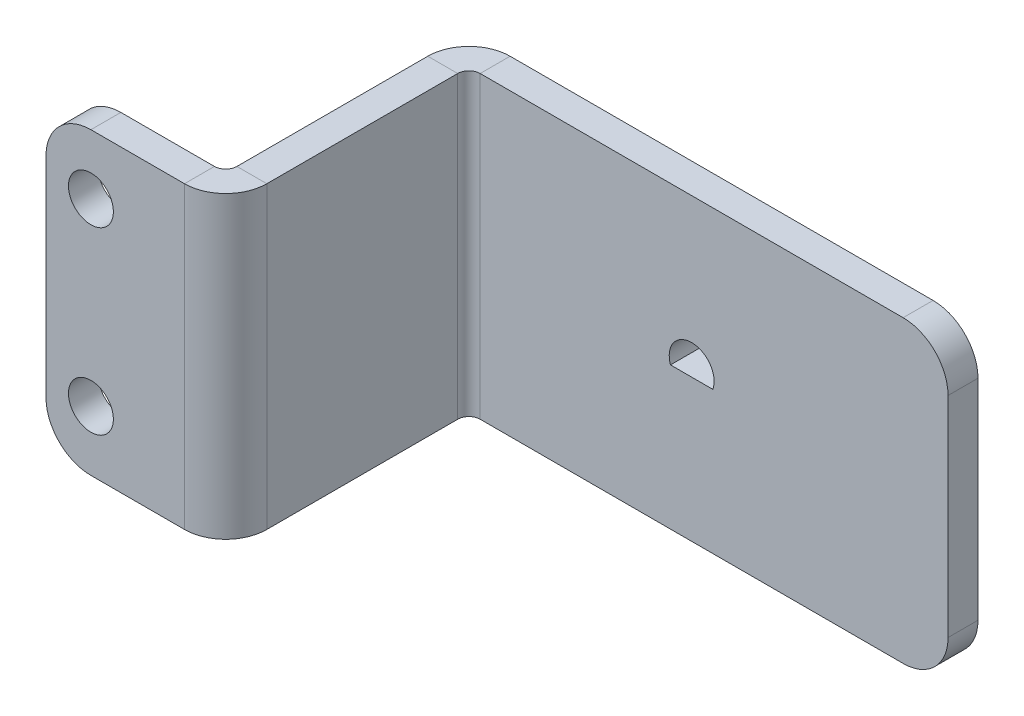
ISO-10303-21;
HEADER;
FILE_DESCRIPTION(('STEP AP214'),'2;1');
FILE_NAME('part.step','',(''),(''),'','','');
FILE_SCHEMA(('AUTOMOTIVE_DESIGN { 1 0 10303 214 1 1 1 1 }'));
ENDSEC;
DATA;
#1=APPLICATION_CONTEXT('core data for automotive mechanical design processes');
#2=APPLICATION_PROTOCOL_DEFINITION('international standard','automotive_design',2000,#1);
#3=PRODUCT_CONTEXT('',#1,'mechanical');
#4=PRODUCT('Part','Part','',(#3));
#5=PRODUCT_RELATED_PRODUCT_CATEGORY('part','',(#4));
#6=PRODUCT_DEFINITION_FORMATION('','',#4);
#7=PRODUCT_DEFINITION_CONTEXT('part definition',#1,'design');
#8=PRODUCT_DEFINITION('design','',#6,#7);
#9=PRODUCT_DEFINITION_SHAPE('','',#8);
#10=(LENGTH_UNIT() NAMED_UNIT(*) SI_UNIT(.MILLI.,.METRE.));
#11=(NAMED_UNIT(*) PLANE_ANGLE_UNIT() SI_UNIT($,.RADIAN.));
#12=(NAMED_UNIT(*) SI_UNIT($,.STERADIAN.) SOLID_ANGLE_UNIT());
#13=UNCERTAINTY_MEASURE_WITH_UNIT(LENGTH_MEASURE(1.E-05),#10,'distance_accuracy_value','');
#14=(GEOMETRIC_REPRESENTATION_CONTEXT(3) GLOBAL_UNCERTAINTY_ASSIGNED_CONTEXT((#13)) GLOBAL_UNIT_ASSIGNED_CONTEXT((#10,
#11,#12)) REPRESENTATION_CONTEXT('',''));
#15=CARTESIAN_POINT('',(0.,0.,0.));
#16=DIRECTION('',(0.,0.,1.));
#17=DIRECTION('',(1.,0.,0.));
#18=AXIS2_PLACEMENT_3D('',#15,#16,#17);
#19=CARTESIAN_POINT('',(0.,17.5999999999969,5.60000000000555));
#20=DIRECTION('',(0.,-5.5440374513438E-13,1.));
#21=DIRECTION('',(1.,0.,0.));
#22=AXIS2_PLACEMENT_3D('',#19,#20,#21);
#23=PLANE('',#22);
#24=DIRECTION('',(-1.,0.,0.));
#25=VECTOR('',#24,1.);
#26=CARTESIAN_POINT('',(0.,-2.40000000000311,5.59999999999447));
#27=LINE('',#26,#25);
#28=CARTESIAN_POINT('',(-2.75,-2.40000000000311,5.59999999999447));
#29=VERTEX_POINT('',#28);
#30=CARTESIAN_POINT('',(-9.00000000000001,-2.40000000000311,5.59999999999447));
#31=VERTEX_POINT('',#30);
#32=EDGE_CURVE('E208',#29,#31,#27,.T.);
#33=ORIENTED_EDGE('',*,*,#32,.T.);
#34=CARTESIAN_POINT('',(-9.00000000000001,0.599999999996892,5.59999999999613));
#35=DIRECTION('',(0.,-5.5440374513438E-13,1.));
#36=DIRECTION('',(1.,0.,0.));
#37=AXIS2_PLACEMENT_3D('',#34,#35,#36);
#38=CIRCLE('',#37,3.);
#39=CARTESIAN_POINT('',(-12.,0.599999999996891,5.59999999999613));
#40=VERTEX_POINT('',#39);
#41=EDGE_CURVE('E378',#31,#40,#38,.F.);
#42=ORIENTED_EDGE('',*,*,#41,.T.);
#43=DIRECTION('',(0.,-1.,-5.5440374513438E-13));
#44=VECTOR('',#43,1.);
#45=CARTESIAN_POINT('',(-12.,17.5999999999969,5.60000000000556));
#46=LINE('',#45,#44);
#47=CARTESIAN_POINT('',(-12.,14.5999999999969,5.60000000000389));
#48=VERTEX_POINT('',#47);
#49=EDGE_CURVE('E328',#48,#40,#46,.T.);
#50=ORIENTED_EDGE('',*,*,#49,.F.);
#51=CARTESIAN_POINT('',(-9.00000000000001,14.5999999999969,5.60000000000389));
#52=DIRECTION('',(0.,-5.5440374513438E-13,1.));
#53=DIRECTION('',(1.,0.,0.));
#54=AXIS2_PLACEMENT_3D('',#51,#52,#53);
#55=CIRCLE('',#54,3.);
#56=CARTESIAN_POINT('',(-9.00000000000001,17.5999999999969,5.60000000000556));
#57=VERTEX_POINT('',#56);
#58=EDGE_CURVE('E375',#48,#57,#55,.F.);
#59=ORIENTED_EDGE('',*,*,#58,.T.);
#60=DIRECTION('',(-1.,0.,0.));
#61=VECTOR('',#60,1.);
#62=CARTESIAN_POINT('',(0.,17.5999999999969,5.60000000000555));
#63=LINE('',#62,#61);
#64=CARTESIAN_POINT('',(-2.75,17.5999999999969,5.60000000000555));
#65=VERTEX_POINT('',#64);
#66=EDGE_CURVE('E209',#65,#57,#63,.T.);
#67=ORIENTED_EDGE('',*,*,#66,.F.);
#68=DIRECTION('',(0.,-1.,-5.5440374513438E-13));
#69=VECTOR('',#68,1.);
#70=CARTESIAN_POINT('',(-2.75,17.5999999999969,5.60000000000555));
#71=LINE('',#70,#69);
#72=EDGE_CURVE('E248',#65,#29,#71,.T.);
#73=ORIENTED_EDGE('',*,*,#72,.T.);
#74=EDGE_LOOP('',(#33,#42,#50,#59,#67,#73));
#75=FACE_BOUND('',#74,.T.);
#76=CARTESIAN_POINT('',(-9.00000000000001,1.59999999999689,5.59999999999668));
#77=DIRECTION('',(0.,-5.5440374513438E-13,1.));
#78=DIRECTION('',(1.,0.,0.));
#79=AXIS2_PLACEMENT_3D('',#76,#77,#78);
#80=CIRCLE('',#79,1.5);
#81=CARTESIAN_POINT('',(-7.50000000000001,1.59999999999689,5.59999999999668));
#82=VERTEX_POINT('',#81);
#83=EDGE_CURVE('E200',#82,#82,#80,.F.);
#84=ORIENTED_EDGE('',*,*,#83,.F.);
#85=EDGE_LOOP('',(#84));
#86=FACE_BOUND('',#85,.T.);
#87=CARTESIAN_POINT('',(-9.00000000000001,13.5999999999969,5.60000000000333));
#88=DIRECTION('',(0.,-5.5440374513438E-13,1.));
#89=DIRECTION('',(1.,0.,0.));
#90=AXIS2_PLACEMENT_3D('',#87,#88,#89);
#91=CIRCLE('',#90,1.5);
#92=CARTESIAN_POINT('',(-7.50000000000001,13.5999999999969,5.60000000000333));
#93=VERTEX_POINT('',#92);
#94=EDGE_CURVE('E204',#93,#93,#91,.T.);
#95=ORIENTED_EDGE('',*,*,#94,.T.);
#96=EDGE_LOOP('',(#95));
#97=FACE_BOUND('',#96,.T.);
#98=ADVANCED_FACE('F48',(#75,#86,#97),#23,.F.);
#99=CARTESIAN_POINT('',(0.,17.5999999999958,7.60000000000555));
#100=DIRECTION('',(0.,-5.5440374513438E-13,1.));
#101=DIRECTION('',(1.,0.,0.));
#102=AXIS2_PLACEMENT_3D('',#99,#100,#101);
#103=PLANE('',#102);
#104=CARTESIAN_POINT('',(-9.00000000000001,1.59999999999578,7.59999999999668));
#105=DIRECTION('',(0.,5.5440374513438E-13,-1.));
#106=DIRECTION('',(0.,1.,5.5440374513438E-13));
#107=AXIS2_PLACEMENT_3D('',#104,#105,#106);
#108=CIRCLE('',#107,1.5);
#109=CARTESIAN_POINT('',(-9.00000000000001,3.09999999999578,7.59999999999752));
#110=VERTEX_POINT('',#109);
#111=EDGE_CURVE('E189',#110,#110,#108,.T.);
#112=ORIENTED_EDGE('',*,*,#111,.T.);
#113=EDGE_LOOP('',(#112));
#114=FACE_BOUND('',#113,.T.);
#115=DIRECTION('',(0.,-1.,-5.5440374513438E-13));
#116=VECTOR('',#115,1.);
#117=CARTESIAN_POINT('',(-12.,17.5999999999958,7.60000000000556));
#118=LINE('',#117,#116);
#119=CARTESIAN_POINT('',(-12.,14.5999999999958,7.60000000000389));
#120=VERTEX_POINT('',#119);
#121=CARTESIAN_POINT('',(-12.,0.599999999995783,7.59999999999613));
#122=VERTEX_POINT('',#121);
#123=EDGE_CURVE('E324',#120,#122,#118,.T.);
#124=ORIENTED_EDGE('',*,*,#123,.T.);
#125=CARTESIAN_POINT('',(-9.00000000000001,0.599999999995784,7.59999999999613));
#126=DIRECTION('',(0.,-5.5440374513438E-13,1.));
#127=DIRECTION('',(1.,0.,0.));
#128=AXIS2_PLACEMENT_3D('',#125,#126,#127);
#129=CIRCLE('',#128,3.);
#130=CARTESIAN_POINT('',(-9.00000000000001,-2.40000000000422,7.59999999999447));
#131=VERTEX_POINT('',#130);
#132=EDGE_CURVE('E56',#122,#131,#129,.T.);
#133=ORIENTED_EDGE('',*,*,#132,.T.);
#134=DIRECTION('',(-1.,0.,0.));
#135=VECTOR('',#134,1.);
#136=CARTESIAN_POINT('',(0.,-2.40000000000422,7.59999999999447));
#137=LINE('',#136,#135);
#138=CARTESIAN_POINT('',(-2.75,-2.40000000000422,7.59999999999447));
#139=VERTEX_POINT('',#138);
#140=EDGE_CURVE('E252',#139,#131,#137,.T.);
#141=ORIENTED_EDGE('',*,*,#140,.F.);
#142=DIRECTION('',(0.,-1.,-5.5440374513438E-13));
#143=VECTOR('',#142,1.);
#144=CARTESIAN_POINT('',(-2.75,17.5999999999958,7.60000000000555));
#145=LINE('',#144,#143);
#146=CARTESIAN_POINT('',(-2.75,17.5999999999958,7.60000000000555));
#147=VERTEX_POINT('',#146);
#148=EDGE_CURVE('E320',#147,#139,#145,.T.);
#149=ORIENTED_EDGE('',*,*,#148,.F.);
#150=DIRECTION('',(-1.,0.,0.));
#151=VECTOR('',#150,1.);
#152=CARTESIAN_POINT('',(0.,17.5999999999958,7.60000000000555));
#153=LINE('',#152,#151);
#154=CARTESIAN_POINT('',(-9.00000000000001,17.5999999999958,7.60000000000555));
#155=VERTEX_POINT('',#154);
#156=EDGE_CURVE('E213',#147,#155,#153,.T.);
#157=ORIENTED_EDGE('',*,*,#156,.T.);
#158=CARTESIAN_POINT('',(-9.00000000000001,14.5999999999958,7.60000000000389));
#159=DIRECTION('',(0.,-5.5440374513438E-13,1.));
#160=DIRECTION('',(1.,0.,0.));
#161=AXIS2_PLACEMENT_3D('',#158,#159,#160);
#162=CIRCLE('',#161,3.);
#163=EDGE_CURVE('E386',#155,#120,#162,.T.);
#164=ORIENTED_EDGE('',*,*,#163,.T.);
#165=EDGE_LOOP('',(#124,#133,#141,#149,#157,#164));
#166=FACE_BOUND('',#165,.T.);
#167=CARTESIAN_POINT('',(-9.00000000000001,13.5999999999958,7.60000000000334));
#168=DIRECTION('',(0.,5.5440374513438E-13,-1.));
#169=DIRECTION('',(0.,1.,5.5440374513438E-13));
#170=AXIS2_PLACEMENT_3D('',#167,#168,#169);
#171=CIRCLE('',#170,1.5);
#172=CARTESIAN_POINT('',(-9.00000000000001,15.0999999999958,7.60000000000417));
#173=VERTEX_POINT('',#172);
#174=EDGE_CURVE('E184',#173,#173,#171,.F.);
#175=ORIENTED_EDGE('',*,*,#174,.F.);
#176=EDGE_LOOP('',(#175));
#177=FACE_BOUND('',#176,.T.);
#178=ADVANCED_FACE('F392',(#114,#166,#177),#103,.T.);
#179=CARTESIAN_POINT('',(0.,17.6000000000048,-8.64999999999445));
#180=DIRECTION('',(0.,-5.5440374513438E-13,1.));
#181=DIRECTION('',(0.,-1.,-5.5440374513438E-13));
#182=AXIS2_PLACEMENT_3D('',#179,#180,#181);
#183=PLANE('',#182);
#184=DIRECTION('',(-1.,0.,0.));
#185=VECTOR('',#184,1.);
#186=CARTESIAN_POINT('',(0.,-2.39999999999521,-8.65000000000554));
#187=LINE('',#186,#185);
#188=CARTESIAN_POINT('',(29.,-2.39999999999521,-8.65000000000554));
#189=VERTEX_POINT('',#188);
#190=CARTESIAN_POINT('',(0.75,-2.39999999999521,-8.65000000000554));
#191=VERTEX_POINT('',#190);
#192=EDGE_CURVE('E268',#189,#191,#187,.T.);
#193=ORIENTED_EDGE('',*,*,#192,.F.);
#194=CARTESIAN_POINT('',(29.,0.600000000004793,-8.65000000000387));
#195=DIRECTION('',(0.,-5.5440374513438E-13,1.));
#196=DIRECTION('',(0.,-1.,-5.5440374513438E-13));
#197=AXIS2_PLACEMENT_3D('',#194,#195,#196);
#198=CIRCLE('',#197,3.);
#199=CARTESIAN_POINT('',(32.,0.600000000004792,-8.65000000000387));
#200=VERTEX_POINT('',#199);
#201=EDGE_CURVE('E356',#189,#200,#198,.T.);
#202=ORIENTED_EDGE('',*,*,#201,.T.);
#203=DIRECTION('',(0.,-1.,-5.5440374513438E-13));
#204=VECTOR('',#203,1.);
#205=CARTESIAN_POINT('',(32.,17.6000000000048,-8.64999999999445));
#206=LINE('',#205,#204);
#207=CARTESIAN_POINT('',(32.,14.6000000000048,-8.64999999999611));
#208=VERTEX_POINT('',#207);
#209=EDGE_CURVE('E304',#208,#200,#206,.T.);
#210=ORIENTED_EDGE('',*,*,#209,.F.);
#211=CARTESIAN_POINT('',(29.,14.6000000000048,-8.64999999999611));
#212=DIRECTION('',(0.,-5.5440374513438E-13,1.));
#213=DIRECTION('',(0.,-1.,-5.5440374513438E-13));
#214=AXIS2_PLACEMENT_3D('',#211,#212,#213);
#215=CIRCLE('',#214,3.);
#216=CARTESIAN_POINT('',(29.,17.6000000000048,-8.64999999999445));
#217=VERTEX_POINT('',#216);
#218=EDGE_CURVE('E353',#208,#217,#215,.T.);
#219=ORIENTED_EDGE('',*,*,#218,.T.);
#220=DIRECTION('',(-1.,0.,0.));
#221=VECTOR('',#220,1.);
#222=CARTESIAN_POINT('',(0.,17.6000000000048,-8.64999999999445));
#223=LINE('',#222,#221);
#224=CARTESIAN_POINT('',(0.75,17.6000000000048,-8.64999999999445));
#225=VERTEX_POINT('',#224);
#226=EDGE_CURVE('E230',#217,#225,#223,.T.);
#227=ORIENTED_EDGE('',*,*,#226,.T.);
#228=DIRECTION('',(0.,-1.,-5.5440374513438E-13));
#229=VECTOR('',#228,1.);
#230=CARTESIAN_POINT('',(0.75,17.6000000000048,-8.64999999999445));
#231=LINE('',#230,#229);
#232=EDGE_CURVE('E308',#225,#191,#231,.T.);
#233=ORIENTED_EDGE('',*,*,#232,.T.);
#234=EDGE_LOOP('',(#193,#202,#210,#219,#227,#233));
#235=FACE_BOUND('',#234,.T.);
#236=DIRECTION('',(1.,0.,0.));
#237=VECTOR('',#236,1.);
#238=CARTESIAN_POINT('',(0.,7.10000000000479,-8.65000000000027));
#239=LINE('',#238,#237);
#240=CARTESIAN_POINT('',(13.4607864376269,7.10000000000479,-8.65000000000027));
#241=VERTEX_POINT('',#240);
#242=CARTESIAN_POINT('',(16.2892135623731,7.10000000000479,-8.65000000000027));
#243=VERTEX_POINT('',#242);
#244=EDGE_CURVE('E179',#241,#243,#239,.T.);
#245=ORIENTED_EDGE('',*,*,#244,.F.);
#246=CARTESIAN_POINT('',(14.875,7.60000000000479,-8.64999999999999));
#247=DIRECTION('',(0.,-5.5440374513438E-13,1.));
#248=DIRECTION('',(0.,-1.,-5.5440374513438E-13));
#249=AXIS2_PLACEMENT_3D('',#246,#247,#248);
#250=CIRCLE('',#249,1.5);
#251=EDGE_CURVE('E192',#241,#243,#250,.F.);
#252=ORIENTED_EDGE('',*,*,#251,.T.);
#253=EDGE_LOOP('',(#245,#252));
#254=FACE_BOUND('',#253,.T.);
#255=ADVANCED_FACE('F471',(#235,#254),#183,.T.);
#256=CARTESIAN_POINT('',(0.,17.6000000000059,-10.6499999999944));
#257=DIRECTION('',(0.,-5.5440374513438E-13,1.));
#258=DIRECTION('',(0.,-1.,-5.5440374513438E-13));
#259=AXIS2_PLACEMENT_3D('',#256,#257,#258);
#260=PLANE('',#259);
#261=DIRECTION('',(0.,-1.,-5.5440374513438E-13));
#262=VECTOR('',#261,1.);
#263=CARTESIAN_POINT('',(32.,17.6000000000059,-10.6499999999944));
#264=LINE('',#263,#262);
#265=CARTESIAN_POINT('',(32.,14.6000000000059,-10.6499999999961));
#266=VERTEX_POINT('',#265);
#267=CARTESIAN_POINT('',(32.,0.6000000000059,-10.6500000000039));
#268=VERTEX_POINT('',#267);
#269=EDGE_CURVE('E300',#266,#268,#264,.T.);
#270=ORIENTED_EDGE('',*,*,#269,.T.);
#271=CARTESIAN_POINT('',(29.,0.600000000005901,-10.6500000000039));
#272=DIRECTION('',(0.,-5.5440374513438E-13,1.));
#273=DIRECTION('',(0.,-1.,-5.5440374513438E-13));
#274=AXIS2_PLACEMENT_3D('',#271,#272,#273);
#275=CIRCLE('',#274,3.);
#276=CARTESIAN_POINT('',(29.,-2.3999999999941,-10.6500000000055));
#277=VERTEX_POINT('',#276);
#278=EDGE_CURVE('E367',#268,#277,#275,.F.);
#279=ORIENTED_EDGE('',*,*,#278,.T.);
#280=DIRECTION('',(1.,0.,0.));
#281=VECTOR('',#280,1.);
#282=CARTESIAN_POINT('',(0.,-2.3999999999941,-10.6500000000055));
#283=LINE('',#282,#281);
#284=CARTESIAN_POINT('',(0.75,-2.3999999999941,-10.6500000000055));
#285=VERTEX_POINT('',#284);
#286=EDGE_CURVE('E271',#277,#285,#283,.F.);
#287=ORIENTED_EDGE('',*,*,#286,.T.);
#288=DIRECTION('',(0.,-1.,-5.5440374513438E-13));
#289=VECTOR('',#288,1.);
#290=CARTESIAN_POINT('',(0.75,17.6000000000059,-10.6499999999944));
#291=LINE('',#290,#289);
#292=CARTESIAN_POINT('',(0.75,17.6000000000059,-10.6499999999944));
#293=VERTEX_POINT('',#292);
#294=EDGE_CURVE('E296',#293,#285,#291,.T.);
#295=ORIENTED_EDGE('',*,*,#294,.F.);
#296=DIRECTION('',(1.,0.,0.));
#297=VECTOR('',#296,1.);
#298=CARTESIAN_POINT('',(0.,17.6000000000059,-10.6499999999944));
#299=LINE('',#298,#297);
#300=CARTESIAN_POINT('',(29.,17.6000000000059,-10.6499999999944));
#301=VERTEX_POINT('',#300);
#302=EDGE_CURVE('E233',#301,#293,#299,.F.);
#303=ORIENTED_EDGE('',*,*,#302,.F.);
#304=CARTESIAN_POINT('',(29.,14.6000000000059,-10.6499999999961));
#305=DIRECTION('',(0.,-5.5440374513438E-13,1.));
#306=DIRECTION('',(0.,-1.,-5.5440374513438E-13));
#307=AXIS2_PLACEMENT_3D('',#304,#305,#306);
#308=CIRCLE('',#307,3.);
#309=EDGE_CURVE('E364',#301,#266,#308,.F.);
#310=ORIENTED_EDGE('',*,*,#309,.T.);
#311=EDGE_LOOP('',(#270,#279,#287,#295,#303,#310));
#312=FACE_BOUND('',#311,.T.);
#313=CARTESIAN_POINT('',(14.875,7.6000000000059,-10.65));
#314=DIRECTION('',(0.,5.5440374513438E-13,-1.));
#315=DIRECTION('',(0.,1.,5.5440374513438E-13));
#316=AXIS2_PLACEMENT_3D('',#313,#314,#315);
#317=CIRCLE('',#316,1.5);
#318=CARTESIAN_POINT('',(13.4607864376269,7.1000000000059,-10.6500000000003));
#319=VERTEX_POINT('',#318);
#320=CARTESIAN_POINT('',(16.2892135623731,7.1000000000059,-10.6500000000003));
#321=VERTEX_POINT('',#320);
#322=EDGE_CURVE('E171',#319,#321,#317,.T.);
#323=ORIENTED_EDGE('',*,*,#322,.F.);
#324=DIRECTION('',(1.,0.,0.));
#325=VECTOR('',#324,1.);
#326=CARTESIAN_POINT('',(0.,7.1000000000059,-10.6500000000003));
#327=LINE('',#326,#325);
#328=EDGE_CURVE('E70',#319,#321,#327,.T.);
#329=ORIENTED_EDGE('',*,*,#328,.T.);
#330=EDGE_LOOP('',(#323,#329));
#331=FACE_BOUND('',#330,.T.);
#332=ADVANCED_FACE('F182',(#312,#331),#260,.F.);
#333=CARTESIAN_POINT('',(-2.75,17.5999999999958,7.60000000000555));
#334=DIRECTION('',(0.,1.,5.5440374513438E-13));
#335=DIRECTION('',(1.,0.,0.));
#336=AXIS2_PLACEMENT_3D('',#333,#334,#335);
#337=PLANE('',#336);
#338=DIRECTION('',(0.,5.5440374513438E-13,-1.));
#339=VECTOR('',#338,1.);
#340=CARTESIAN_POINT('',(-2.75,17.5999999999958,7.60000000000555));
#341=LINE('',#340,#339);
#342=EDGE_CURVE('E348',#147,#65,#341,.T.);
#343=ORIENTED_EDGE('',*,*,#342,.F.);
#344=CARTESIAN_POINT('',(-2.75,17.5999999999973,4.85000000000555));
#345=DIRECTION('',(0.,-1.,-5.5440374513438E-13));
#346=DIRECTION('',(-1.,0.,0.));
#347=AXIS2_PLACEMENT_3D('',#344,#345,#346);
#348=CIRCLE('',#347,2.75);
#349=CARTESIAN_POINT('',(0.,17.5999999999973,4.85000000000555));
#350=VERTEX_POINT('',#349);
#351=EDGE_CURVE('E218',#350,#147,#348,.T.);
#352=ORIENTED_EDGE('',*,*,#351,.F.);
#353=DIRECTION('',(1.,0.,0.));
#354=VECTOR('',#353,1.);
#355=CARTESIAN_POINT('',(-2.,17.5999999999973,4.85000000000555));
#356=LINE('',#355,#354);
#357=CARTESIAN_POINT('',(-2.,17.5999999999973,4.85000000000555));
#358=VERTEX_POINT('',#357);
#359=EDGE_CURVE('E346',#358,#350,#356,.T.);
#360=ORIENTED_EDGE('',*,*,#359,.F.);
#361=CARTESIAN_POINT('',(-2.75,17.5999999999973,4.85000000000555));
#362=DIRECTION('',(0.,1.,5.5440374513438E-13));
#363=DIRECTION('',(1.,0.,0.));
#364=AXIS2_PLACEMENT_3D('',#361,#362,#363);
#365=CIRCLE('',#364,0.75);
#366=EDGE_CURVE('E244',#358,#65,#365,.F.);
#367=ORIENTED_EDGE('',*,*,#366,.T.);
#368=EDGE_LOOP('',(#343,#352,#360,#367));
#369=FACE_BOUND('',#368,.T.);
#370=ADVANCED_FACE('F420',(#369),#337,.T.);
#371=CARTESIAN_POINT('',(-2.,17.5999999999973,4.85000000000555));
#372=DIRECTION('',(0.,1.,5.5440374513438E-13));
#373=DIRECTION('',(1.,0.,0.));
#374=AXIS2_PLACEMENT_3D('',#371,#372,#373);
#375=PLANE('',#374);
#376=ORIENTED_EDGE('',*,*,#66,.T.);
#377=DIRECTION('',(0.,5.5440374513438E-13,-1.));
#378=VECTOR('',#377,1.);
#379=CARTESIAN_POINT('',(-9.00000000000001,17.5999999999973,4.85000000000555));
#380=LINE('',#379,#378);
#381=EDGE_CURVE('E11',#57,#155,#380,.F.);
#382=ORIENTED_EDGE('',*,*,#381,.T.);
#383=ORIENTED_EDGE('',*,*,#156,.F.);
#384=ORIENTED_EDGE('',*,*,#342,.T.);
#385=EDGE_LOOP('',(#376,#382,#383,#384));
#386=FACE_BOUND('',#385,.T.);
#387=ADVANCED_FACE('F414',(#386),#375,.T.);
#388=CARTESIAN_POINT('',(0.,-2.40000000000269,4.84999999999447));
#389=DIRECTION('',(0.,-1.,-5.5440374513438E-13));
#390=DIRECTION('',(-1.,0.,0.));
#391=AXIS2_PLACEMENT_3D('',#388,#389,#390);
#392=PLANE('',#391);
#393=DIRECTION('',(-1.,0.,0.));
#394=VECTOR('',#393,1.);
#395=CARTESIAN_POINT('',(0.,-2.40000000000269,4.84999999999447));
#396=LINE('',#395,#394);
#397=CARTESIAN_POINT('',(0.,-2.40000000000269,4.84999999999447));
#398=VERTEX_POINT('',#397);
#399=CARTESIAN_POINT('',(-2.,-2.40000000000269,4.84999999999447));
#400=VERTEX_POINT('',#399);
#401=EDGE_CURVE('E344',#398,#400,#396,.T.);
#402=ORIENTED_EDGE('',*,*,#401,.F.);
#403=CARTESIAN_POINT('',(-2.75,-2.40000000000269,4.84999999999447));
#404=DIRECTION('',(0.,-1.,-5.5440374513438E-13));
#405=DIRECTION('',(-1.,0.,0.));
#406=AXIS2_PLACEMENT_3D('',#403,#404,#405);
#407=CIRCLE('',#406,2.75);
#408=EDGE_CURVE('E256',#398,#139,#407,.T.);
#409=ORIENTED_EDGE('',*,*,#408,.T.);
#410=DIRECTION('',(0.,-5.5440374513438E-13,1.));
#411=VECTOR('',#410,1.);
#412=CARTESIAN_POINT('',(-2.75,-2.40000000000311,5.59999999999447));
#413=LINE('',#412,#411);
#414=EDGE_CURVE('E342',#29,#139,#413,.T.);
#415=ORIENTED_EDGE('',*,*,#414,.F.);
#416=CARTESIAN_POINT('',(-2.75,-2.40000000000269,4.84999999999447));
#417=DIRECTION('',(0.,1.,5.5440374513438E-13));
#418=DIRECTION('',(1.,0.,0.));
#419=AXIS2_PLACEMENT_3D('',#416,#417,#418);
#420=CIRCLE('',#419,0.75);
#421=EDGE_CURVE('E214',#400,#29,#420,.F.);
#422=ORIENTED_EDGE('',*,*,#421,.F.);
#423=EDGE_LOOP('',(#402,#409,#415,#422));
#424=FACE_BOUND('',#423,.T.);
#425=ADVANCED_FACE('F426',(#424),#392,.T.);
#426=CARTESIAN_POINT('',(-2.75,-2.40000000000311,5.59999999999447));
#427=DIRECTION('',(0.,-1.,-5.5440374513438E-13));
#428=DIRECTION('',(-1.,0.,0.));
#429=AXIS2_PLACEMENT_3D('',#426,#427,#428);
#430=PLANE('',#429);
#431=DIRECTION('',(0.,-5.5440374513438E-13,1.));
#432=VECTOR('',#431,1.);
#433=CARTESIAN_POINT('',(0.,-2.40000000000422,7.59999999999447));
#434=LINE('',#433,#432);
#435=CARTESIAN_POINT('',(0.,-2.39999999999562,-7.90000000000553));
#436=VERTEX_POINT('',#435);
#437=EDGE_CURVE('E260',#436,#398,#434,.T.);
#438=ORIENTED_EDGE('',*,*,#437,.T.);
#439=ORIENTED_EDGE('',*,*,#401,.T.);
#440=DIRECTION('',(0.,5.5440374513438E-13,-1.));
#441=VECTOR('',#440,1.);
#442=CARTESIAN_POINT('',(-2.,-2.40000000000422,7.59999999999447));
#443=LINE('',#442,#441);
#444=CARTESIAN_POINT('',(-2.,-2.39999999999562,-7.90000000000553));
#445=VERTEX_POINT('',#444);
#446=EDGE_CURVE('E278',#445,#400,#443,.F.);
#447=ORIENTED_EDGE('',*,*,#446,.F.);
#448=DIRECTION('',(1.,0.,0.));
#449=VECTOR('',#448,1.);
#450=CARTESIAN_POINT('',(-2.,-2.39999999999562,-7.90000000000553));
#451=LINE('',#450,#449);
#452=EDGE_CURVE('E332',#445,#436,#451,.T.);
#453=ORIENTED_EDGE('',*,*,#452,.T.);
#454=EDGE_LOOP('',(#438,#439,#447,#453));
#455=FACE_BOUND('',#454,.T.);
#456=ADVANCED_FACE('F433',(#455),#430,.T.);
#457=CARTESIAN_POINT('',(0.,17.6000000000044,-7.89999999999445));
#458=DIRECTION('',(0.,1.,5.5440374513438E-13));
#459=DIRECTION('',(1.,0.,0.));
#460=AXIS2_PLACEMENT_3D('',#457,#458,#459);
#461=PLANE('',#460);
#462=DIRECTION('',(-1.,0.,0.));
#463=VECTOR('',#462,1.);
#464=CARTESIAN_POINT('',(0.,17.6000000000044,-7.89999999999445));
#465=LINE('',#464,#463);
#466=CARTESIAN_POINT('',(0.,17.6000000000044,-7.89999999999445));
#467=VERTEX_POINT('',#466);
#468=CARTESIAN_POINT('',(-2.,17.6000000000044,-7.89999999999445));
#469=VERTEX_POINT('',#468);
#470=EDGE_CURVE('E340',#467,#469,#465,.T.);
#471=ORIENTED_EDGE('',*,*,#470,.F.);
#472=CARTESIAN_POINT('',(0.75,17.6000000000044,-7.89999999999445));
#473=DIRECTION('',(0.,1.,5.5440374513438E-13));
#474=DIRECTION('',(1.,0.,0.));
#475=AXIS2_PLACEMENT_3D('',#472,#473,#474);
#476=CIRCLE('',#475,0.75);
#477=EDGE_CURVE('E226',#225,#467,#476,.T.);
#478=ORIENTED_EDGE('',*,*,#477,.F.);
#479=DIRECTION('',(0.,-5.5440374513438E-13,1.));
#480=VECTOR('',#479,1.);
#481=CARTESIAN_POINT('',(0.75,17.6000000000059,-10.6499999999944));
#482=LINE('',#481,#480);
#483=EDGE_CURVE('E337',#293,#225,#482,.T.);
#484=ORIENTED_EDGE('',*,*,#483,.F.);
#485=CARTESIAN_POINT('',(0.75,17.6000000000044,-7.89999999999445));
#486=DIRECTION('',(0.,1.,5.5440374513438E-13));
#487=DIRECTION('',(1.,0.,0.));
#488=AXIS2_PLACEMENT_3D('',#485,#486,#487);
#489=CIRCLE('',#488,2.75);
#490=EDGE_CURVE('E236',#293,#469,#489,.T.);
#491=ORIENTED_EDGE('',*,*,#490,.T.);
#492=EDGE_LOOP('',(#471,#478,#484,#491));
#493=FACE_BOUND('',#492,.T.);
#494=ADVANCED_FACE('F450',(#493),#461,.T.);
#495=CARTESIAN_POINT('',(0.75,17.6000000000059,-10.6499999999944));
#496=DIRECTION('',(0.,1.,5.5440374513438E-13));
#497=DIRECTION('',(1.,0.,0.));
#498=AXIS2_PLACEMENT_3D('',#495,#496,#497);
#499=PLANE('',#498);
#500=DIRECTION('',(0.,-5.5440374513438E-13,1.));
#501=VECTOR('',#500,1.);
#502=CARTESIAN_POINT('',(0.,17.5999999999958,7.60000000000555));
#503=LINE('',#502,#501);
#504=EDGE_CURVE('E222',#467,#350,#503,.T.);
#505=ORIENTED_EDGE('',*,*,#504,.F.);
#506=ORIENTED_EDGE('',*,*,#470,.T.);
#507=DIRECTION('',(0.,5.5440374513438E-13,-1.));
#508=VECTOR('',#507,1.);
#509=CARTESIAN_POINT('',(-2.,17.5999999999958,7.60000000000555));
#510=LINE('',#509,#508);
#511=EDGE_CURVE('E240',#469,#358,#510,.F.);
#512=ORIENTED_EDGE('',*,*,#511,.T.);
#513=ORIENTED_EDGE('',*,*,#359,.T.);
#514=EDGE_LOOP('',(#505,#506,#512,#513));
#515=FACE_BOUND('',#514,.T.);
#516=ADVANCED_FACE('F455',(#515),#499,.T.);
#517=CARTESIAN_POINT('',(0.75,-2.39999999999521,-8.65000000000554));
#518=DIRECTION('',(0.,-1.,-5.5440374513438E-13));
#519=DIRECTION('',(-1.,0.,0.));
#520=AXIS2_PLACEMENT_3D('',#517,#518,#519);
#521=PLANE('',#520);
#522=DIRECTION('',(0.,5.5440374513438E-13,-1.));
#523=VECTOR('',#522,1.);
#524=CARTESIAN_POINT('',(0.75,-2.39999999999521,-8.65000000000554));
#525=LINE('',#524,#523);
#526=EDGE_CURVE('E334',#191,#285,#525,.T.);
#527=ORIENTED_EDGE('',*,*,#526,.F.);
#528=CARTESIAN_POINT('',(0.75,-2.39999999999562,-7.90000000000553));
#529=DIRECTION('',(0.,1.,5.5440374513438E-13));
#530=DIRECTION('',(1.,0.,0.));
#531=AXIS2_PLACEMENT_3D('',#528,#529,#530);
#532=CIRCLE('',#531,0.75);
#533=EDGE_CURVE('E264',#191,#436,#532,.T.);
#534=ORIENTED_EDGE('',*,*,#533,.T.);
#535=ORIENTED_EDGE('',*,*,#452,.F.);
#536=CARTESIAN_POINT('',(0.75,-2.39999999999562,-7.90000000000553));
#537=DIRECTION('',(0.,1.,5.5440374513438E-13));
#538=DIRECTION('',(1.,0.,0.));
#539=AXIS2_PLACEMENT_3D('',#536,#537,#538);
#540=CIRCLE('',#539,2.75);
#541=EDGE_CURVE('E274',#285,#445,#540,.T.);
#542=ORIENTED_EDGE('',*,*,#541,.F.);
#543=EDGE_LOOP('',(#527,#534,#535,#542));
#544=FACE_BOUND('',#543,.T.);
#545=ADVANCED_FACE('F442',(#544),#521,.T.);
#546=CARTESIAN_POINT('',(-2.,-2.39999999999562,-7.90000000000553));
#547=DIRECTION('',(0.,-1.,-5.5440374513438E-13));
#548=DIRECTION('',(-1.,0.,0.));
#549=AXIS2_PLACEMENT_3D('',#546,#547,#548);
#550=PLANE('',#549);
#551=ORIENTED_EDGE('',*,*,#286,.F.);
#552=DIRECTION('',(0.,-5.5440374513438E-13,1.));
#553=VECTOR('',#552,1.);
#554=CARTESIAN_POINT('',(29.,-2.39999999999562,-7.90000000000553));
#555=LINE('',#554,#553);
#556=EDGE_CURVE('E350',#277,#189,#555,.T.);
#557=ORIENTED_EDGE('',*,*,#556,.T.);
#558=ORIENTED_EDGE('',*,*,#192,.T.);
#559=ORIENTED_EDGE('',*,*,#526,.T.);
#560=EDGE_LOOP('',(#551,#557,#558,#559));
#561=FACE_BOUND('',#560,.T.);
#562=ADVANCED_FACE('F468',(#561),#550,.T.);
#563=CARTESIAN_POINT('',(-12.,17.5999999999958,7.60000000000556));
#564=DIRECTION('',(-1.,0.,0.));
#565=DIRECTION('',(0.,1.,5.5440374513438E-13));
#566=AXIS2_PLACEMENT_3D('',#563,#564,#565);
#567=PLANE('',#566);
#568=ORIENTED_EDGE('',*,*,#49,.T.);
#569=DIRECTION('',(0.,5.5440374513438E-13,-1.));
#570=VECTOR('',#569,1.);
#571=CARTESIAN_POINT('',(-12.,0.599999999995783,7.59999999999613));
#572=LINE('',#571,#570);
#573=EDGE_CURVE('E384',#40,#122,#572,.F.);
#574=ORIENTED_EDGE('',*,*,#573,.T.);
#575=ORIENTED_EDGE('',*,*,#123,.F.);
#576=DIRECTION('',(0.,5.5440374513438E-13,-1.));
#577=VECTOR('',#576,1.);
#578=CARTESIAN_POINT('',(-12.,14.5999999999958,7.60000000000389));
#579=LINE('',#578,#577);
#580=EDGE_CURVE('E381',#120,#48,#579,.T.);
#581=ORIENTED_EDGE('',*,*,#580,.T.);
#582=EDGE_LOOP('',(#568,#574,#575,#581));
#583=FACE_BOUND('',#582,.T.);
#584=ADVANCED_FACE('F407',(#583),#567,.T.);
#585=CARTESIAN_POINT('',(-2.75,17.5999999999973,4.85000000000555));
#586=DIRECTION('',(0.,-1.,-5.5440374513438E-13));
#587=DIRECTION('',(-1.,0.,0.));
#588=AXIS2_PLACEMENT_3D('',#585,#586,#587);
#589=CYLINDRICAL_SURFACE('',#588,2.75);
#590=ORIENTED_EDGE('',*,*,#408,.F.);
#591=DIRECTION('',(0.,-1.,-5.5440374513438E-13));
#592=VECTOR('',#591,1.);
#593=CARTESIAN_POINT('',(0.,17.5999999999973,4.85000000000555));
#594=LINE('',#593,#592);
#595=EDGE_CURVE('E316',#350,#398,#594,.T.);
#596=ORIENTED_EDGE('',*,*,#595,.F.);
#597=ORIENTED_EDGE('',*,*,#351,.T.);
#598=ORIENTED_EDGE('',*,*,#148,.T.);
#599=EDGE_LOOP('',(#590,#596,#597,#598));
#600=FACE_BOUND('',#599,.T.);
#601=ADVANCED_FACE('F430',(#600),#589,.T.);
#602=CARTESIAN_POINT('',(0.,17.5999999999958,7.60000000000555));
#603=DIRECTION('',(1.,0.,0.));
#604=DIRECTION('',(0.,-1.,-5.5440374513438E-13));
#605=AXIS2_PLACEMENT_3D('',#602,#603,#604);
#606=PLANE('',#605);
#607=ORIENTED_EDGE('',*,*,#437,.F.);
#608=DIRECTION('',(0.,-1.,-5.5440374513438E-13));
#609=VECTOR('',#608,1.);
#610=CARTESIAN_POINT('',(0.,17.6000000000044,-7.89999999999445));
#611=LINE('',#610,#609);
#612=EDGE_CURVE('E312',#467,#436,#611,.T.);
#613=ORIENTED_EDGE('',*,*,#612,.F.);
#614=ORIENTED_EDGE('',*,*,#504,.T.);
#615=ORIENTED_EDGE('',*,*,#595,.T.);
#616=EDGE_LOOP('',(#607,#613,#614,#615));
#617=FACE_BOUND('',#616,.T.);
#618=ADVANCED_FACE('F437',(#617),#606,.T.);
#619=CARTESIAN_POINT('',(0.75,17.6000000000044,-7.89999999999445));
#620=DIRECTION('',(0.,-1.,-5.5440374513438E-13));
#621=DIRECTION('',(-1.,0.,0.));
#622=AXIS2_PLACEMENT_3D('',#619,#620,#621);
#623=CYLINDRICAL_SURFACE('',#622,0.75);
#624=ORIENTED_EDGE('',*,*,#533,.F.);
#625=ORIENTED_EDGE('',*,*,#232,.F.);
#626=ORIENTED_EDGE('',*,*,#477,.T.);
#627=ORIENTED_EDGE('',*,*,#612,.T.);
#628=EDGE_LOOP('',(#624,#625,#626,#627));
#629=FACE_BOUND('',#628,.T.);
#630=ADVANCED_FACE('F446',(#629),#623,.F.);
#631=CARTESIAN_POINT('',(32.,17.6000000000059,-10.6499999999944));
#632=DIRECTION('',(1.,0.,0.));
#633=DIRECTION('',(0.,-1.,-5.5440374513438E-13));
#634=AXIS2_PLACEMENT_3D('',#631,#632,#633);
#635=PLANE('',#634);
#636=ORIENTED_EDGE('',*,*,#209,.T.);
#637=DIRECTION('',(0.,-5.5440374513438E-13,1.));
#638=VECTOR('',#637,1.);
#639=CARTESIAN_POINT('',(32.,0.6000000000059,-10.6500000000039));
#640=LINE('',#639,#638);
#641=EDGE_CURVE('E362',#200,#268,#640,.F.);
#642=ORIENTED_EDGE('',*,*,#641,.T.);
#643=ORIENTED_EDGE('',*,*,#269,.F.);
#644=DIRECTION('',(0.,-5.5440374513438E-13,1.));
#645=VECTOR('',#644,1.);
#646=CARTESIAN_POINT('',(32.,14.6000000000048,-8.64999999999611));
#647=LINE('',#646,#645);
#648=EDGE_CURVE('E359',#266,#208,#647,.T.);
#649=ORIENTED_EDGE('',*,*,#648,.T.);
#650=EDGE_LOOP('',(#636,#642,#643,#649));
#651=FACE_BOUND('',#650,.T.);
#652=ADVANCED_FACE('F483',(#651),#635,.T.);
#653=CARTESIAN_POINT('',(0.75,17.6000000000044,-7.89999999999445));
#654=DIRECTION('',(0.,-1.,-5.5440374513438E-13));
#655=DIRECTION('',(-1.,0.,0.));
#656=AXIS2_PLACEMENT_3D('',#653,#654,#655);
#657=CYLINDRICAL_SURFACE('',#656,2.75);
#658=ORIENTED_EDGE('',*,*,#541,.T.);
#659=DIRECTION('',(0.,-1.,-5.5440374513438E-13));
#660=VECTOR('',#659,1.);
#661=CARTESIAN_POINT('',(-2.,17.6000000000044,-7.89999999999445));
#662=LINE('',#661,#660);
#663=EDGE_CURVE('E292',#469,#445,#662,.T.);
#664=ORIENTED_EDGE('',*,*,#663,.F.);
#665=ORIENTED_EDGE('',*,*,#490,.F.);
#666=ORIENTED_EDGE('',*,*,#294,.T.);
#667=EDGE_LOOP('',(#658,#664,#665,#666));
#668=FACE_BOUND('',#667,.T.);
#669=ADVANCED_FACE('F460',(#668),#657,.T.);
#670=CARTESIAN_POINT('',(-2.,17.5999999999958,7.60000000000555));
#671=DIRECTION('',(1.,0.,0.));
#672=DIRECTION('',(0.,-1.,-5.5440374513438E-13));
#673=AXIS2_PLACEMENT_3D('',#670,#671,#672);
#674=PLANE('',#673);
#675=ORIENTED_EDGE('',*,*,#446,.T.);
#676=DIRECTION('',(0.,-1.,-5.5440374513438E-13));
#677=VECTOR('',#676,1.);
#678=CARTESIAN_POINT('',(-2.,17.5999999999973,4.85000000000555));
#679=LINE('',#678,#677);
#680=EDGE_CURVE('E288',#358,#400,#679,.T.);
#681=ORIENTED_EDGE('',*,*,#680,.F.);
#682=ORIENTED_EDGE('',*,*,#511,.F.);
#683=ORIENTED_EDGE('',*,*,#663,.T.);
#684=EDGE_LOOP('',(#675,#681,#682,#683));
#685=FACE_BOUND('',#684,.T.);
#686=ADVANCED_FACE('F458',(#685),#674,.F.);
#687=CARTESIAN_POINT('',(-2.75,17.5999999999973,4.85000000000555));
#688=DIRECTION('',(0.,-1.,-5.5440374513438E-13));
#689=DIRECTION('',(-1.,0.,0.));
#690=AXIS2_PLACEMENT_3D('',#687,#688,#689);
#691=CYLINDRICAL_SURFACE('',#690,0.75);
#692=ORIENTED_EDGE('',*,*,#421,.T.);
#693=ORIENTED_EDGE('',*,*,#72,.F.);
#694=ORIENTED_EDGE('',*,*,#366,.F.);
#695=ORIENTED_EDGE('',*,*,#680,.T.);
#696=EDGE_LOOP('',(#692,#693,#694,#695));
#697=FACE_BOUND('',#696,.T.);
#698=ADVANCED_FACE('F422',(#697),#691,.F.);
#699=CARTESIAN_POINT('',(-2.75,17.5999999999973,4.85000000000555));
#700=DIRECTION('',(0.,-1.,-5.5440374513438E-13));
#701=DIRECTION('',(-1.,0.,0.));
#702=AXIS2_PLACEMENT_3D('',#699,#700,#701);
#703=PLANE('',#702);
#704=ORIENTED_EDGE('',*,*,#226,.F.);
#705=DIRECTION('',(0.,-5.5440374513438E-13,1.));
#706=VECTOR('',#705,1.);
#707=CARTESIAN_POINT('',(29.,17.6000000000059,-10.6499999999944));
#708=LINE('',#707,#706);
#709=EDGE_CURVE('E370',#217,#301,#708,.F.);
#710=ORIENTED_EDGE('',*,*,#709,.T.);
#711=ORIENTED_EDGE('',*,*,#302,.T.);
#712=ORIENTED_EDGE('',*,*,#483,.T.);
#713=EDGE_LOOP('',(#704,#710,#711,#712));
#714=FACE_BOUND('',#713,.T.);
#715=ADVANCED_FACE('F477',(#714),#703,.F.);
#716=CARTESIAN_POINT('',(-2.75,-2.40000000000269,4.84999999999447));
#717=DIRECTION('',(0.,-1.,-5.5440374513438E-13));
#718=DIRECTION('',(-1.,0.,0.));
#719=AXIS2_PLACEMENT_3D('',#716,#717,#718);
#720=PLANE('',#719);
#721=ORIENTED_EDGE('',*,*,#140,.T.);
#722=DIRECTION('',(0.,5.5440374513438E-13,-1.));
#723=VECTOR('',#722,1.);
#724=CARTESIAN_POINT('',(-9.00000000000001,-2.40000000000269,4.84999999999447));
#725=LINE('',#724,#723);
#726=EDGE_CURVE('E372',#131,#31,#725,.T.);
#727=ORIENTED_EDGE('',*,*,#726,.T.);
#728=ORIENTED_EDGE('',*,*,#32,.F.);
#729=ORIENTED_EDGE('',*,*,#414,.T.);
#730=EDGE_LOOP('',(#721,#727,#728,#729));
#731=FACE_BOUND('',#730,.T.);
#732=ADVANCED_FACE('F400',(#731),#720,.T.);
#733=CARTESIAN_POINT('',(29.,0.600000000004377,-7.90000000000387));
#734=DIRECTION('',(0.,-5.5440374513438E-13,1.));
#735=DIRECTION('',(0.,-1.,-5.5440374513438E-13));
#736=AXIS2_PLACEMENT_3D('',#733,#734,#735);
#737=CYLINDRICAL_SURFACE('',#736,3.);
#738=ORIENTED_EDGE('',*,*,#278,.F.);
#739=ORIENTED_EDGE('',*,*,#641,.F.);
#740=ORIENTED_EDGE('',*,*,#201,.F.);
#741=ORIENTED_EDGE('',*,*,#556,.F.);
#742=EDGE_LOOP('',(#738,#739,#740,#741));
#743=FACE_BOUND('',#742,.T.);
#744=ADVANCED_FACE('F486',(#743),#737,.T.);
#745=CARTESIAN_POINT('',(29.,14.6000000000059,-10.6499999999961));
#746=DIRECTION('',(0.,5.5440374513438E-13,-1.));
#747=DIRECTION('',(0.,1.,5.5440374513438E-13));
#748=AXIS2_PLACEMENT_3D('',#745,#746,#747);
#749=CYLINDRICAL_SURFACE('',#748,3.);
#750=ORIENTED_EDGE('',*,*,#309,.F.);
#751=ORIENTED_EDGE('',*,*,#709,.F.);
#752=ORIENTED_EDGE('',*,*,#218,.F.);
#753=ORIENTED_EDGE('',*,*,#648,.F.);
#754=EDGE_LOOP('',(#750,#751,#752,#753));
#755=FACE_BOUND('',#754,.T.);
#756=ADVANCED_FACE('F479',(#755),#749,.T.);
#757=CARTESIAN_POINT('',(-9.00000000000001,0.599999999997308,4.84999999999613));
#758=DIRECTION('',(0.,5.5440374513438E-13,-1.));
#759=DIRECTION('',(0.,1.,5.5440374513438E-13));
#760=AXIS2_PLACEMENT_3D('',#757,#758,#759);
#761=CYLINDRICAL_SURFACE('',#760,3.);
#762=ORIENTED_EDGE('',*,*,#132,.F.);
#763=ORIENTED_EDGE('',*,*,#573,.F.);
#764=ORIENTED_EDGE('',*,*,#41,.F.);
#765=ORIENTED_EDGE('',*,*,#726,.F.);
#766=EDGE_LOOP('',(#762,#763,#764,#765));
#767=FACE_BOUND('',#766,.T.);
#768=ADVANCED_FACE('F402',(#767),#761,.T.);
#769=CARTESIAN_POINT('',(-9.00000000000001,14.5999999999958,7.60000000000389));
#770=DIRECTION('',(0.,5.5440374513438E-13,-1.));
#771=DIRECTION('',(0.,1.,5.5440374513438E-13));
#772=AXIS2_PLACEMENT_3D('',#769,#770,#771);
#773=CYLINDRICAL_SURFACE('',#772,3.);
#774=ORIENTED_EDGE('',*,*,#163,.F.);
#775=ORIENTED_EDGE('',*,*,#381,.F.);
#776=ORIENTED_EDGE('',*,*,#58,.F.);
#777=ORIENTED_EDGE('',*,*,#580,.F.);
#778=EDGE_LOOP('',(#774,#775,#776,#777));
#779=FACE_BOUND('',#778,.T.);
#780=ADVANCED_FACE('F50',(#779),#773,.T.);
#781=CARTESIAN_POINT('',(0.,7.1000000000059,-10.6500000000003));
#782=DIRECTION('',(0.,-1.,-5.5440374513438E-13));
#783=DIRECTION('',(-1.,0.,0.));
#784=AXIS2_PLACEMENT_3D('',#781,#782,#783);
#785=PLANE('',#784);
#786=ORIENTED_EDGE('',*,*,#244,.T.);
#787=DIRECTION('',(0.,-5.5440374513438E-13,1.));
#788=VECTOR('',#787,1.);
#789=CARTESIAN_POINT('',(16.2892135623731,7.1000000000059,-10.6500000000003));
#790=LINE('',#789,#788);
#791=EDGE_CURVE('E63',#321,#243,#790,.T.);
#792=ORIENTED_EDGE('',*,*,#791,.F.);
#793=ORIENTED_EDGE('',*,*,#328,.F.);
#794=DIRECTION('',(0.,-5.5440374513438E-13,1.));
#795=VECTOR('',#794,1.);
#796=CARTESIAN_POINT('',(13.4607864376269,7.1000000000059,-10.6500000000003));
#797=LINE('',#796,#795);
#798=EDGE_CURVE('E173',#319,#241,#797,.T.);
#799=ORIENTED_EDGE('',*,*,#798,.T.);
#800=EDGE_LOOP('',(#786,#792,#793,#799));
#801=FACE_BOUND('',#800,.T.);
#802=ADVANCED_FACE('F177',(#801),#785,.F.);
#803=CARTESIAN_POINT('',(14.875,7.6000000000059,-10.65));
#804=DIRECTION('',(0.,-5.5440374513438E-13,1.));
#805=DIRECTION('',(0.,-1.,-5.5440374513438E-13));
#806=AXIS2_PLACEMENT_3D('',#803,#804,#805);
#807=CYLINDRICAL_SURFACE('',#806,1.5);
#808=ORIENTED_EDGE('',*,*,#798,.F.);
#809=ORIENTED_EDGE('',*,*,#322,.T.);
#810=ORIENTED_EDGE('',*,*,#791,.T.);
#811=ORIENTED_EDGE('',*,*,#251,.F.);
#812=EDGE_LOOP('',(#808,#809,#810,#811));
#813=FACE_BOUND('',#812,.T.);
#814=ADVANCED_FACE('F172',(#813),#807,.F.);
#815=CARTESIAN_POINT('',(-9.00000000000001,1.6000000000059,-10.6500000000033));
#816=DIRECTION('',(0.,-5.5440374513438E-13,1.));
#817=DIRECTION('',(0.,-1.,-5.5440374513438E-13));
#818=AXIS2_PLACEMENT_3D('',#815,#816,#817);
#819=CYLINDRICAL_SURFACE('',#818,1.5);
#820=ORIENTED_EDGE('',*,*,#111,.F.);
#821=EDGE_LOOP('',(#820));
#822=FACE_BOUND('',#821,.T.);
#823=ORIENTED_EDGE('',*,*,#83,.T.);
#824=EDGE_LOOP('',(#823));
#825=FACE_BOUND('',#824,.T.);
#826=ADVANCED_FACE('F571',(#822,#825),#819,.F.);
#827=CARTESIAN_POINT('',(-9.00000000000001,13.6000000000059,-10.6499999999967));
#828=DIRECTION('',(0.,-5.5440374513438E-13,1.));
#829=DIRECTION('',(0.,-1.,-5.5440374513438E-13));
#830=AXIS2_PLACEMENT_3D('',#827,#828,#829);
#831=CYLINDRICAL_SURFACE('',#830,1.5);
#832=ORIENTED_EDGE('',*,*,#174,.T.);
#833=EDGE_LOOP('',(#832));
#834=FACE_BOUND('',#833,.T.);
#835=ORIENTED_EDGE('',*,*,#94,.F.);
#836=EDGE_LOOP('',(#835));
#837=FACE_BOUND('',#836,.T.);
#838=ADVANCED_FACE('F596',(#834,#837),#831,.F.);
#839=CLOSED_SHELL('',(#98,#178,#255,#332,#370,#387,#425,#456,#494,#516,#545,#562,#584,#601,#618,
#630,#652,#669,#686,#698,#715,#732,#744,#756,#768,#780,#802,#814,#826,#838));
#840=MANIFOLD_SOLID_BREP('B2',#839);
#841=ADVANCED_BREP_SHAPE_REPRESENTATION('',(#18,#840),#14);
#842=SHAPE_DEFINITION_REPRESENTATION(#9,#841);
ENDSEC;
END-ISO-10303-21;
